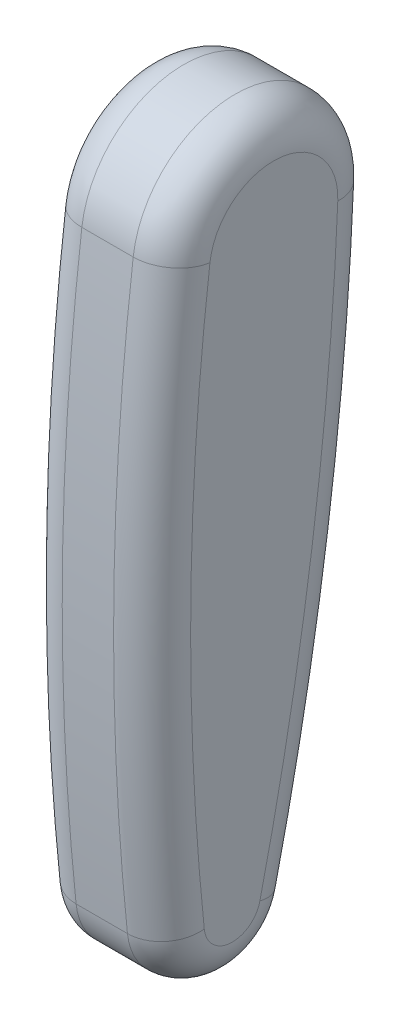
ISO-10303-21;
HEADER;
FILE_DESCRIPTION(('STEP AP214'),'2;1');
FILE_NAME('part.step','',(''),(''),'','','');
FILE_SCHEMA(('AUTOMOTIVE_DESIGN { 1 0 10303 214 1 1 1 1 }'));
ENDSEC;
DATA;
#1=APPLICATION_CONTEXT('core data for automotive mechanical design processes');
#2=APPLICATION_PROTOCOL_DEFINITION('international standard','automotive_design',2000,#1);
#3=PRODUCT_CONTEXT('',#1,'mechanical');
#4=PRODUCT('Part','Part','',(#3));
#5=PRODUCT_RELATED_PRODUCT_CATEGORY('part','',(#4));
#6=PRODUCT_DEFINITION_FORMATION('','',#4);
#7=PRODUCT_DEFINITION_CONTEXT('part definition',#1,'design');
#8=PRODUCT_DEFINITION('design','',#6,#7);
#9=PRODUCT_DEFINITION_SHAPE('','',#8);
#10=(LENGTH_UNIT() NAMED_UNIT(*) SI_UNIT(.MILLI.,.METRE.));
#11=(NAMED_UNIT(*) PLANE_ANGLE_UNIT() SI_UNIT($,.RADIAN.));
#12=(NAMED_UNIT(*) SI_UNIT($,.STERADIAN.) SOLID_ANGLE_UNIT());
#13=UNCERTAINTY_MEASURE_WITH_UNIT(LENGTH_MEASURE(1.E-05),#10,'distance_accuracy_value','');
#14=(GEOMETRIC_REPRESENTATION_CONTEXT(3) GLOBAL_UNCERTAINTY_ASSIGNED_CONTEXT((#13)) GLOBAL_UNIT_ASSIGNED_CONTEXT((#10,
#11,#12)) REPRESENTATION_CONTEXT('',''));
#15=CARTESIAN_POINT('',(0.,0.,0.));
#16=DIRECTION('',(0.,0.,1.));
#17=DIRECTION('',(1.,0.,0.));
#18=AXIS2_PLACEMENT_3D('',#15,#16,#17);
#19=CARTESIAN_POINT('',(222.250000000002,-234.840307231112,-1250.38847130733));
#20=DIRECTION('',(1.,0.,0.));
#21=DIRECTION('',(0.,0.,-0.999999999999998));
#22=AXIS2_PLACEMENT_3D('',#19,#20,#21);
#23=CYLINDRICAL_SURFACE('',#22,1270.);
#24=DIRECTION('',(1.,0.,0.));
#25=VECTOR('',#24,1.);
#26=CARTESIAN_POINT('',(222.250000000001,-366.5733757267,12.7609255039653));
#27=LINE('',#26,#25);
#28=CARTESIAN_POINT('',(241.300000000001,-366.573375726697,12.7609255039657));
#29=VERTEX_POINT('',#28);
#30=CARTESIAN_POINT('',(266.699999999998,-366.573375726697,12.7609255039656));
#31=VERTEX_POINT('',#30);
#32=EDGE_CURVE('E138',#29,#31,#27,.T.);
#33=ORIENTED_EDGE('',*,*,#32,.T.);
#34=CARTESIAN_POINT('',(266.700000000002,-234.84030723111,-1250.38847130733));
#35=DIRECTION('',(-1.,0.,0.));
#36=DIRECTION('',(0.,0.,0.999999999999998));
#37=AXIS2_PLACEMENT_3D('',#34,#35,#36);
#38=CIRCLE('',#37,1270.);
#39=CARTESIAN_POINT('',(266.7,-78.2306079922418,9.9183969213224));
#40=VERTEX_POINT('',#39);
#41=EDGE_CURVE('E159',#31,#40,#38,.T.);
#42=ORIENTED_EDGE('',*,*,#41,.T.);
#43=DIRECTION('',(1.,0.,0.));
#44=VECTOR('',#43,1.);
#45=CARTESIAN_POINT('',(222.250000000001,-78.2306079922417,9.91839692132233));
#46=LINE('',#45,#44);
#47=CARTESIAN_POINT('',(241.300000000001,-78.2306079922416,9.91839692132253));
#48=VERTEX_POINT('',#47);
#49=EDGE_CURVE('E112',#48,#40,#46,.T.);
#50=ORIENTED_EDGE('',*,*,#49,.F.);
#51=CARTESIAN_POINT('',(241.300000000002,-234.840307231112,-1250.38847130733));
#52=DIRECTION('',(-1.,0.,0.));
#53=DIRECTION('',(0.,0.,0.999999999999998));
#54=AXIS2_PLACEMENT_3D('',#51,#52,#53);
#55=CIRCLE('',#54,1270.);
#56=EDGE_CURVE('E157',#48,#29,#55,.F.);
#57=ORIENTED_EDGE('',*,*,#56,.T.);
#58=EDGE_LOOP('',(#33,#42,#50,#57));
#59=FACE_BOUND('',#58,.T.);
#60=ADVANCED_FACE('F28',(#59),#23,.T.);
#61=CARTESIAN_POINT('',(222.250000000001,-84.4949959617962,-40.4938778078232));
#62=DIRECTION('',(1.,0.,0.));
#63=DIRECTION('',(0.,0.,-0.999999999999998));
#64=AXIS2_PLACEMENT_3D('',#61,#62,#63);
#65=CYLINDRICAL_SURFACE('',#64,50.7999999999996);
#66=ORIENTED_EDGE('',*,*,#49,.T.);
#67=CARTESIAN_POINT('',(266.699999999998,-84.4949959617966,-40.4938778078229));
#68=DIRECTION('',(-1.,0.,0.));
#69=DIRECTION('',(0.,0.,0.999999999999998));
#70=AXIS2_PLACEMENT_3D('',#67,#68,#69);
#71=CIRCLE('',#70,50.7999999999996);
#72=CARTESIAN_POINT('',(266.699999999998,-86.6438502438299,-91.2484088890433));
#73=VERTEX_POINT('',#72);
#74=EDGE_CURVE('E111',#40,#73,#71,.T.);
#75=ORIENTED_EDGE('',*,*,#74,.T.);
#76=DIRECTION('',(1.,0.,0.));
#77=VECTOR('',#76,1.);
#78=CARTESIAN_POINT('',(222.249999999999,-86.6438502438298,-91.2484088890433));
#79=LINE('',#78,#77);
#80=CARTESIAN_POINT('',(241.299999999999,-86.6438502438296,-91.248408889043));
#81=VERTEX_POINT('',#80);
#82=EDGE_CURVE('E94',#81,#73,#79,.T.);
#83=ORIENTED_EDGE('',*,*,#82,.F.);
#84=CARTESIAN_POINT('',(241.300000000001,-84.4949959617964,-40.493877807823));
#85=DIRECTION('',(-1.,0.,0.));
#86=DIRECTION('',(0.,0.,0.999999999999998));
#87=AXIS2_PLACEMENT_3D('',#84,#85,#86);
#88=CIRCLE('',#87,50.7999999999996);
#89=EDGE_CURVE('E108',#81,#48,#88,.F.);
#90=ORIENTED_EDGE('',*,*,#89,.T.);
#91=EDGE_LOOP('',(#66,#75,#83,#90));
#92=FACE_BOUND('',#91,.T.);
#93=ADVANCED_FACE('F107',(#92),#65,.T.);
#94=CARTESIAN_POINT('',(222.250000000002,-22.1782217828216,1431.38752354757));
#95=DIRECTION('',(1.,0.,0.));
#96=DIRECTION('',(0.,0.,-0.999999999999998));
#97=AXIS2_PLACEMENT_3D('',#94,#95,#96);
#98=CYLINDRICAL_SURFACE('',#97,1524.);
#99=ORIENTED_EDGE('',*,*,#82,.T.);
#100=CARTESIAN_POINT('',(266.699999999998,-22.1782217828216,1431.38752354757));
#101=DIRECTION('',(-1.,0.,0.));
#102=DIRECTION('',(0.,0.,0.999999999999998));
#103=AXIS2_PLACEMENT_3D('',#100,#101,#102);
#104=CIRCLE('',#103,1524.);
#105=CARTESIAN_POINT('',(266.7,-370.699612750102,-52.2259166848291));
#106=VERTEX_POINT('',#105);
#107=EDGE_CURVE('E100',#73,#106,#104,.T.);
#108=ORIENTED_EDGE('',*,*,#107,.T.);
#109=DIRECTION('',(1.,0.,0.));
#110=VECTOR('',#109,1.);
#111=CARTESIAN_POINT('',(222.25,-370.699612750103,-52.2259166848291));
#112=LINE('',#111,#110);
#113=CARTESIAN_POINT('',(241.3,-370.699612750103,-52.2259166848295));
#114=VERTEX_POINT('',#113);
#115=EDGE_CURVE('E96',#114,#106,#112,.T.);
#116=ORIENTED_EDGE('',*,*,#115,.F.);
#117=CARTESIAN_POINT('',(241.300000000002,-22.1782217828213,1431.38752354757));
#118=DIRECTION('',(-1.,0.,0.));
#119=DIRECTION('',(0.,0.,0.999999999999998));
#120=AXIS2_PLACEMENT_3D('',#117,#118,#119);
#121=CIRCLE('',#120,1524.);
#122=EDGE_CURVE('E91',#114,#81,#121,.F.);
#123=ORIENTED_EDGE('',*,*,#122,.T.);
#124=EDGE_LOOP('',(#99,#108,#116,#123));
#125=FACE_BOUND('',#124,.T.);
#126=ADVANCED_FACE('F93',(#125),#98,.T.);
#127=CARTESIAN_POINT('',(222.250000000002,-363.148315945812,-20.0809588131273));
#128=DIRECTION('',(1.,0.,0.));
#129=DIRECTION('',(0.,0.,-0.999999999999998));
#130=AXIS2_PLACEMENT_3D('',#127,#128,#129);
#131=CYLINDRICAL_SURFACE('',#130,33.0199999999998);
#132=ORIENTED_EDGE('',*,*,#115,.T.);
#133=CARTESIAN_POINT('',(266.699999999998,-363.148315945812,-20.0809588131275));
#134=DIRECTION('',(-1.,0.,0.));
#135=DIRECTION('',(0.,0.,0.999999999999998));
#136=AXIS2_PLACEMENT_3D('',#133,#134,#135);
#137=CIRCLE('',#136,33.0199999999998);
#138=EDGE_CURVE('E155',#106,#31,#137,.T.);
#139=ORIENTED_EDGE('',*,*,#138,.T.);
#140=ORIENTED_EDGE('',*,*,#32,.F.);
#141=CARTESIAN_POINT('',(241.300000000002,-363.148315945816,-20.0809588131284));
#142=DIRECTION('',(-1.,0.,0.));
#143=DIRECTION('',(0.,0.,0.999999999999998));
#144=AXIS2_PLACEMENT_3D('',#141,#142,#143);
#145=CIRCLE('',#144,33.0199999999998);
#146=EDGE_CURVE('E153',#29,#114,#145,.F.);
#147=ORIENTED_EDGE('',*,*,#146,.T.);
#148=EDGE_LOOP('',(#132,#139,#140,#147));
#149=FACE_BOUND('',#148,.T.);
#150=ADVANCED_FACE('F175',(#149),#131,.T.);
#151=CARTESIAN_POINT('',(222.250000000001,-159.667651596454,-645.441174557571));
#152=DIRECTION('',(-1.,0.,0.));
#153=DIRECTION('',(0.,0.,0.999999999999998));
#154=AXIS2_PLACEMENT_3D('',#151,#152,#153);
#155=PLANE('',#154);
#156=CARTESIAN_POINT('',(222.250000000002,-22.1782217828216,1431.38752354757));
#157=DIRECTION('',(-1.,0.,0.));
#158=DIRECTION('',(0.,0.,0.999999999999998));
#159=AXIS2_PLACEMENT_3D('',#156,#157,#158);
#160=CIRCLE('',#159,1504.95);
#161=CARTESIAN_POINT('',(222.250000000002,-85.8380298880678,-72.2154597335859));
#162=VERTEX_POINT('',#161);
#163=CARTESIAN_POINT('',(222.250000000001,-366.343095363012,-33.6807486819243));
#164=VERTEX_POINT('',#163);
#165=EDGE_CURVE('E35',#162,#164,#160,.T.);
#166=ORIENTED_EDGE('',*,*,#165,.T.);
#167=CARTESIAN_POINT('',(222.250000000002,-363.148315945812,-20.0809588131273));
#168=DIRECTION('',(-1.,0.,0.));
#169=DIRECTION('',(0.,0.,0.999999999999998));
#170=AXIS2_PLACEMENT_3D('',#167,#168,#169);
#171=CIRCLE('',#170,13.9699999999998);
#172=CARTESIAN_POINT('',(222.250000000001,-364.597379699268,-6.18631544820465));
#173=VERTEX_POINT('',#172);
#174=EDGE_CURVE('E11',#164,#173,#171,.T.);
#175=ORIENTED_EDGE('',*,*,#174,.T.);
#176=CARTESIAN_POINT('',(222.250000000002,-234.840307231112,-1250.38847130733));
#177=DIRECTION('',(-1.,0.,0.));
#178=DIRECTION('',(0.,0.,0.999999999999998));
#179=AXIS2_PLACEMENT_3D('',#176,#177,#178);
#180=CIRCLE('',#179,1250.95);
#181=CARTESIAN_POINT('',(222.250000000001,-80.5797534808245,-8.98620610210733));
#182=VERTEX_POINT('',#181);
#183=EDGE_CURVE('E161',#173,#182,#180,.T.);
#184=ORIENTED_EDGE('',*,*,#183,.T.);
#185=CARTESIAN_POINT('',(222.250000000001,-84.4949959617962,-40.4938778078232));
#186=DIRECTION('',(-1.,0.,0.));
#187=DIRECTION('',(0.,0.,0.999999999999998));
#188=AXIS2_PLACEMENT_3D('',#185,#186,#187);
#189=CIRCLE('',#188,31.7499999999996);
#190=EDGE_CURVE('E45',#182,#162,#189,.T.);
#191=ORIENTED_EDGE('',*,*,#190,.T.);
#192=EDGE_LOOP('',(#166,#175,#184,#191));
#193=FACE_BOUND('',#192,.T.);
#194=ADVANCED_FACE('F164',(#193),#155,.T.);
#195=CARTESIAN_POINT('',(285.750000000002,-159.667651596452,-645.441174557572));
#196=DIRECTION('',(-1.,0.,0.));
#197=DIRECTION('',(0.,0.,0.999999999999998));
#198=AXIS2_PLACEMENT_3D('',#195,#196,#197);
#199=PLANE('',#198);
#200=CARTESIAN_POINT('',(285.749999999998,-22.1782217828214,1431.38752354757));
#201=DIRECTION('',(-1.,0.,0.));
#202=DIRECTION('',(0.,0.,0.999999999999998));
#203=AXIS2_PLACEMENT_3D('',#200,#201,#202);
#204=CIRCLE('',#203,1504.95);
#205=CARTESIAN_POINT('',(285.749999999998,-366.343095363012,-33.6807486819242));
#206=VERTEX_POINT('',#205);
#207=CARTESIAN_POINT('',(285.749999999996,-85.838029888068,-72.215459733586));
#208=VERTEX_POINT('',#207);
#209=EDGE_CURVE('E148',#206,#208,#204,.F.);
#210=ORIENTED_EDGE('',*,*,#209,.T.);
#211=CARTESIAN_POINT('',(285.749999999998,-84.4949959617967,-40.4938778078229));
#212=DIRECTION('',(-1.,0.,0.));
#213=DIRECTION('',(0.,0.,0.999999999999998));
#214=AXIS2_PLACEMENT_3D('',#211,#212,#213);
#215=CIRCLE('',#214,31.7499999999996);
#216=CARTESIAN_POINT('',(285.75,-80.5797534808252,-8.98620610210739));
#217=VERTEX_POINT('',#216);
#218=EDGE_CURVE('E101',#208,#217,#215,.F.);
#219=ORIENTED_EDGE('',*,*,#218,.T.);
#220=CARTESIAN_POINT('',(285.750000000002,-234.840307231111,-1250.38847130733));
#221=DIRECTION('',(-1.,0.,0.));
#222=DIRECTION('',(0.,0.,0.999999999999998));
#223=AXIS2_PLACEMENT_3D('',#220,#221,#222);
#224=CIRCLE('',#223,1250.95);
#225=CARTESIAN_POINT('',(285.749999999998,-364.597379699264,-6.18631544820392));
#226=VERTEX_POINT('',#225);
#227=EDGE_CURVE('E144',#217,#226,#224,.F.);
#228=ORIENTED_EDGE('',*,*,#227,.T.);
#229=CARTESIAN_POINT('',(285.749999999998,-363.148315945812,-20.0809588131276));
#230=DIRECTION('',(-1.,0.,0.));
#231=DIRECTION('',(0.,0.,0.999999999999998));
#232=AXIS2_PLACEMENT_3D('',#229,#230,#231);
#233=CIRCLE('',#232,13.9699999999998);
#234=EDGE_CURVE('E146',#226,#206,#233,.F.);
#235=ORIENTED_EDGE('',*,*,#234,.T.);
#236=EDGE_LOOP('',(#210,#219,#228,#235));
#237=FACE_BOUND('',#236,.T.);
#238=ADVANCED_FACE('F199',(#237),#199,.F.);
#239=CARTESIAN_POINT('',(266.699999999998,-363.148315945812,-20.0809588131275));
#240=DIRECTION('',(-1.,0.,0.));
#241=DIRECTION('',(0.,0.,0.999999999999998));
#242=AXIS2_PLACEMENT_3D('',#239,#240,#241);
#243=DEGENERATE_TOROIDAL_SURFACE('',#242,13.9699999999998,19.05,.T.);
#244=CARTESIAN_POINT('',(266.699999999998,-366.343095363012,-33.6807486819245));
#245=DIRECTION('',(0.,0.973499632698427,-0.228688576750188));
#246=DIRECTION('',(0.,0.228688576750188,0.973499632698427));
#247=AXIS2_PLACEMENT_3D('',#244,#245,#246);
#248=CIRCLE('',#247,19.05);
#249=EDGE_CURVE('E132',#206,#106,#248,.T.);
#250=ORIENTED_EDGE('',*,*,#249,.F.);
#251=ORIENTED_EDGE('',*,*,#234,.F.);
#252=CARTESIAN_POINT('',(266.699999999998,-364.597379699263,-6.18631544820383));
#253=DIRECTION('',(0.,0.994605824260859,0.103726825587077));
#254=DIRECTION('',(0.,-0.103726825587077,0.994605824260859));
#255=AXIS2_PLACEMENT_3D('',#252,#253,#254);
#256=CIRCLE('',#255,19.05);
#257=EDGE_CURVE('E135',#31,#226,#256,.T.);
#258=ORIENTED_EDGE('',*,*,#257,.F.);
#259=ORIENTED_EDGE('',*,*,#138,.F.);
#260=EDGE_LOOP('',(#250,#251,#258,#259));
#261=FACE_BOUND('',#260,.T.);
#262=ADVANCED_FACE('F202',(#261),#243,.T.);
#263=CARTESIAN_POINT('',(266.700000000002,-234.84030723111,-1250.38847130733));
#264=DIRECTION('',(-1.,0.,0.));
#265=DIRECTION('',(0.,0.,0.999999999999998));
#266=AXIS2_PLACEMENT_3D('',#263,#264,#265);
#267=TOROIDAL_SURFACE('',#266,1250.95,19.05);
#268=ORIENTED_EDGE('',*,*,#257,.T.);
#269=ORIENTED_EDGE('',*,*,#227,.F.);
#270=CARTESIAN_POINT('',(266.7,-80.5797534808249,-8.98620610210722));
#271=DIRECTION('',(0.,0.992367612778463,-0.123314723810133));
#272=DIRECTION('',(0.,0.123314723810133,0.992367612778463));
#273=AXIS2_PLACEMENT_3D('',#270,#271,#272);
#274=CIRCLE('',#273,19.05);
#275=EDGE_CURVE('E125',#40,#217,#274,.T.);
#276=ORIENTED_EDGE('',*,*,#275,.F.);
#277=ORIENTED_EDGE('',*,*,#41,.F.);
#278=EDGE_LOOP('',(#268,#269,#276,#277));
#279=FACE_BOUND('',#278,.T.);
#280=ADVANCED_FACE('F206',(#279),#267,.T.);
#281=CARTESIAN_POINT('',(266.699999999998,-22.1782217828216,1431.38752354757));
#282=DIRECTION('',(-1.,0.,0.));
#283=DIRECTION('',(0.,0.,0.999999999999998));
#284=AXIS2_PLACEMENT_3D('',#281,#282,#283);
#285=TOROIDAL_SURFACE('',#284,1504.95,19.05);
#286=ORIENTED_EDGE('',*,*,#249,.T.);
#287=ORIENTED_EDGE('',*,*,#107,.F.);
#288=CARTESIAN_POINT('',(266.699999999996,-85.8380298880679,-72.2154597335859));
#289=DIRECTION('',(0.,0.99910494254371,-0.0423002811423874));
#290=DIRECTION('',(0.,0.0423002811423874,0.99910494254371));
#291=AXIS2_PLACEMENT_3D('',#288,#289,#290);
#292=CIRCLE('',#291,19.05);
#293=EDGE_CURVE('E123',#208,#73,#292,.T.);
#294=ORIENTED_EDGE('',*,*,#293,.F.);
#295=ORIENTED_EDGE('',*,*,#209,.F.);
#296=EDGE_LOOP('',(#286,#287,#294,#295));
#297=FACE_BOUND('',#296,.T.);
#298=ADVANCED_FACE('F210',(#297),#285,.T.);
#299=CARTESIAN_POINT('',(266.699999999998,-84.4949959617966,-40.4938778078229));
#300=DIRECTION('',(-1.,0.,0.));
#301=DIRECTION('',(0.,0.,0.999999999999998));
#302=AXIS2_PLACEMENT_3D('',#299,#300,#301);
#303=TOROIDAL_SURFACE('',#302,31.7499999999996,19.05);
#304=ORIENTED_EDGE('',*,*,#275,.T.);
#305=ORIENTED_EDGE('',*,*,#218,.F.);
#306=ORIENTED_EDGE('',*,*,#293,.T.);
#307=ORIENTED_EDGE('',*,*,#74,.F.);
#308=EDGE_LOOP('',(#304,#305,#306,#307));
#309=FACE_BOUND('',#308,.T.);
#310=ADVANCED_FACE('F214',(#309),#303,.T.);
#311=CARTESIAN_POINT('',(241.300000000001,-84.4949959617964,-40.493877807823));
#312=DIRECTION('',(-1.,0.,0.));
#313=DIRECTION('',(0.,0.,0.999999999999998));
#314=AXIS2_PLACEMENT_3D('',#311,#312,#313);
#315=TOROIDAL_SURFACE('',#314,31.7499999999996,19.05);
#316=CARTESIAN_POINT('',(241.300000000001,-80.5797534808246,-8.98620610210726));
#317=DIRECTION('',(0.,-0.992367612778458,0.123314723810132));
#318=DIRECTION('',(0.,-0.123314723810132,-0.992367612778458));
#319=AXIS2_PLACEMENT_3D('',#316,#317,#318);
#320=CIRCLE('',#319,19.05);
#321=EDGE_CURVE('E119',#48,#182,#320,.T.);
#322=ORIENTED_EDGE('',*,*,#321,.F.);
#323=ORIENTED_EDGE('',*,*,#89,.F.);
#324=CARTESIAN_POINT('',(241.300000000002,-85.838029888067,-72.2154597335851));
#325=DIRECTION('',(0.,-0.999104942543708,0.0423002811423948));
#326=DIRECTION('',(0.,-0.0423002811423948,-0.999104942543708));
#327=AXIS2_PLACEMENT_3D('',#324,#325,#326);
#328=CIRCLE('',#327,19.05);
#329=EDGE_CURVE('E117',#162,#81,#328,.T.);
#330=ORIENTED_EDGE('',*,*,#329,.F.);
#331=ORIENTED_EDGE('',*,*,#190,.F.);
#332=EDGE_LOOP('',(#322,#323,#330,#331));
#333=FACE_BOUND('',#332,.T.);
#334=ADVANCED_FACE('F116',(#333),#315,.T.);
#335=CARTESIAN_POINT('',(241.300000000002,-22.1782217828213,1431.38752354757));
#336=DIRECTION('',(-1.,0.,0.));
#337=DIRECTION('',(0.,0.,0.999999999999998));
#338=AXIS2_PLACEMENT_3D('',#335,#336,#337);
#339=TOROIDAL_SURFACE('',#338,1504.95,19.05);
#340=ORIENTED_EDGE('',*,*,#329,.T.);
#341=ORIENTED_EDGE('',*,*,#122,.F.);
#342=CARTESIAN_POINT('',(241.300000000001,-366.343095363012,-33.6807486819246));
#343=DIRECTION('',(0.,-0.973499632698427,0.228688576750185));
#344=DIRECTION('',(0.,-0.228688576750185,-0.973499632698427));
#345=AXIS2_PLACEMENT_3D('',#342,#343,#344);
#346=CIRCLE('',#345,19.05);
#347=EDGE_CURVE('E127',#164,#114,#346,.T.);
#348=ORIENTED_EDGE('',*,*,#347,.F.);
#349=ORIENTED_EDGE('',*,*,#165,.F.);
#350=EDGE_LOOP('',(#340,#341,#348,#349));
#351=FACE_BOUND('',#350,.T.);
#352=ADVANCED_FACE('F122',(#351),#339,.T.);
#353=CARTESIAN_POINT('',(241.300000000002,-234.840307231112,-1250.38847130733));
#354=DIRECTION('',(-1.,0.,0.));
#355=DIRECTION('',(0.,0.,0.999999999999998));
#356=AXIS2_PLACEMENT_3D('',#353,#354,#355);
#357=TOROIDAL_SURFACE('',#356,1250.95,19.05);
#358=ORIENTED_EDGE('',*,*,#321,.T.);
#359=ORIENTED_EDGE('',*,*,#183,.F.);
#360=CARTESIAN_POINT('',(241.300000000001,-364.597379699264,-6.18631544820407));
#361=DIRECTION('',(0.,-0.994605824260859,-0.103726825587077));
#362=DIRECTION('',(0.,0.103726825587077,-0.994605824260859));
#363=AXIS2_PLACEMENT_3D('',#360,#361,#362);
#364=CIRCLE('',#363,19.05);
#365=EDGE_CURVE('E169',#29,#173,#364,.T.);
#366=ORIENTED_EDGE('',*,*,#365,.F.);
#367=ORIENTED_EDGE('',*,*,#56,.F.);
#368=EDGE_LOOP('',(#358,#359,#366,#367));
#369=FACE_BOUND('',#368,.T.);
#370=ADVANCED_FACE('F168',(#369),#357,.T.);
#371=CARTESIAN_POINT('',(241.300000000002,-363.148315945816,-20.0809588131284));
#372=DIRECTION('',(-1.,0.,0.));
#373=DIRECTION('',(0.,0.,0.999999999999998));
#374=AXIS2_PLACEMENT_3D('',#371,#372,#373);
#375=DEGENERATE_TOROIDAL_SURFACE('',#374,13.9699999999998,19.05,.T.);
#376=ORIENTED_EDGE('',*,*,#347,.T.);
#377=ORIENTED_EDGE('',*,*,#146,.F.);
#378=ORIENTED_EDGE('',*,*,#365,.T.);
#379=ORIENTED_EDGE('',*,*,#174,.F.);
#380=EDGE_LOOP('',(#376,#377,#378,#379));
#381=FACE_BOUND('',#380,.T.);
#382=ADVANCED_FACE('F178',(#381),#375,.T.);
#383=CLOSED_SHELL('',(#60,#93,#126,#150,#194,#238,#262,#280,#298,#310,#334,#352,#370,#382));
#384=MANIFOLD_SOLID_BREP('B2',#383);
#385=ADVANCED_BREP_SHAPE_REPRESENTATION('',(#18,#384),#14);
#386=SHAPE_DEFINITION_REPRESENTATION(#9,#385);
ENDSEC;
END-ISO-10303-21;
